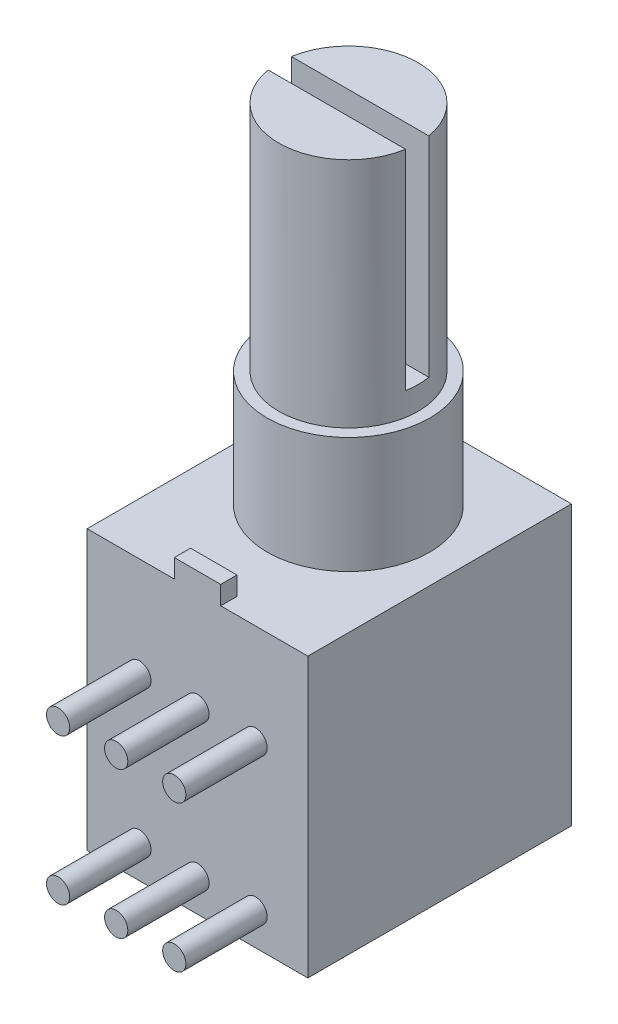
ISO-10303-21;
HEADER;
FILE_DESCRIPTION(('STEP AP214'),'2;1');
FILE_NAME('part.step','',(''),(''),'','','');
FILE_SCHEMA(('AUTOMOTIVE_DESIGN { 1 0 10303 214 1 1 1 1 }'));
ENDSEC;
DATA;
#1=APPLICATION_CONTEXT('core data for automotive mechanical design processes');
#2=APPLICATION_PROTOCOL_DEFINITION('international standard','automotive_design',2000,#1);
#3=PRODUCT_CONTEXT('',#1,'mechanical');
#4=PRODUCT('Part','Part','',(#3));
#5=PRODUCT_RELATED_PRODUCT_CATEGORY('part','',(#4));
#6=PRODUCT_DEFINITION_FORMATION('','',#4);
#7=PRODUCT_DEFINITION_CONTEXT('part definition',#1,'design');
#8=PRODUCT_DEFINITION('design','',#6,#7);
#9=PRODUCT_DEFINITION_SHAPE('','',#8);
#10=(LENGTH_UNIT() NAMED_UNIT(*) SI_UNIT(.MILLI.,.METRE.));
#11=(NAMED_UNIT(*) PLANE_ANGLE_UNIT() SI_UNIT($,.RADIAN.));
#12=(NAMED_UNIT(*) SI_UNIT($,.STERADIAN.) SOLID_ANGLE_UNIT());
#13=UNCERTAINTY_MEASURE_WITH_UNIT(LENGTH_MEASURE(1.E-05),#10,'distance_accuracy_value','');
#14=(GEOMETRIC_REPRESENTATION_CONTEXT(3) GLOBAL_UNCERTAINTY_ASSIGNED_CONTEXT((#13)) GLOBAL_UNIT_ASSIGNED_CONTEXT((#10,
#11,#12)) REPRESENTATION_CONTEXT('',''));
#15=CARTESIAN_POINT('',(0.,0.,0.));
#16=DIRECTION('',(0.,0.,1.));
#17=DIRECTION('',(1.,0.,0.));
#18=AXIS2_PLACEMENT_3D('',#15,#16,#17);
#19=CARTESIAN_POINT('',(0.,0.,0.));
#20=DIRECTION('',(0.,1.,0.));
#21=DIRECTION('',(0.,0.,1.));
#22=AXIS2_PLACEMENT_3D('',#19,#20,#21);
#23=PLANE('',#22);
#24=CARTESIAN_POINT('',(0.,0.,0.));
#25=DIRECTION('',(0.,1.,0.));
#26=DIRECTION('',(0.,0.,1.));
#27=AXIS2_PLACEMENT_3D('',#24,#25,#26);
#28=CIRCLE('',#27,3.5);
#29=CARTESIAN_POINT('',(0.,0.,3.5));
#30=VERTEX_POINT('',#29);
#31=EDGE_CURVE('E177',#30,#30,#28,.T.);
#32=ORIENTED_EDGE('',*,*,#31,.F.);
#33=EDGE_LOOP('',(#32));
#34=FACE_BOUND('',#33,.T.);
#35=DIRECTION('',(1.,0.,0.));
#36=VECTOR('',#35,1.);
#37=CARTESIAN_POINT('',(-4.75,0.,6.5));
#38=LINE('',#37,#36);
#39=CARTESIAN_POINT('',(-4.75,0.,6.5));
#40=VERTEX_POINT('',#39);
#41=CARTESIAN_POINT('',(-1.,0.,6.5));
#42=VERTEX_POINT('',#41);
#43=EDGE_CURVE('E202',#40,#42,#38,.T.);
#44=ORIENTED_EDGE('',*,*,#43,.T.);
#45=DIRECTION('',(0.,0.,1.));
#46=VECTOR('',#45,1.);
#47=CARTESIAN_POINT('',(-1.,0.,6.5));
#48=LINE('',#47,#46);
#49=CARTESIAN_POINT('',(-1.,0.,5.8));
#50=VERTEX_POINT('',#49);
#51=EDGE_CURVE('E147',#50,#42,#48,.T.);
#52=ORIENTED_EDGE('',*,*,#51,.F.);
#53=DIRECTION('',(-1.,0.,0.));
#54=VECTOR('',#53,1.);
#55=CARTESIAN_POINT('',(-1.,0.,5.8));
#56=LINE('',#55,#54);
#57=CARTESIAN_POINT('',(1.,0.,5.8));
#58=VERTEX_POINT('',#57);
#59=EDGE_CURVE('E143',#58,#50,#56,.T.);
#60=ORIENTED_EDGE('',*,*,#59,.F.);
#61=DIRECTION('',(0.,0.,-1.));
#62=VECTOR('',#61,1.);
#63=CARTESIAN_POINT('',(1.,0.,6.5));
#64=LINE('',#63,#62);
#65=CARTESIAN_POINT('',(1.,0.,6.5));
#66=VERTEX_POINT('',#65);
#67=EDGE_CURVE('E362',#66,#58,#64,.T.);
#68=ORIENTED_EDGE('',*,*,#67,.F.);
#69=CARTESIAN_POINT('',(4.75,0.,6.5));
#70=VERTEX_POINT('',#69);
#71=EDGE_CURVE('E201',#66,#70,#38,.T.);
#72=ORIENTED_EDGE('',*,*,#71,.T.);
#73=DIRECTION('',(0.,0.,-1.));
#74=VECTOR('',#73,1.);
#75=CARTESIAN_POINT('',(4.75,0.,-4.85));
#76=LINE('',#75,#74);
#77=CARTESIAN_POINT('',(4.75,0.,-4.85));
#78=VERTEX_POINT('',#77);
#79=EDGE_CURVE('E204',#70,#78,#76,.T.);
#80=ORIENTED_EDGE('',*,*,#79,.T.);
#81=DIRECTION('',(-1.,0.,0.));
#82=VECTOR('',#81,1.);
#83=CARTESIAN_POINT('',(-4.75,0.,-4.85));
#84=LINE('',#83,#82);
#85=CARTESIAN_POINT('',(-4.75,0.,-4.85));
#86=VERTEX_POINT('',#85);
#87=EDGE_CURVE('E189',#78,#86,#84,.T.);
#88=ORIENTED_EDGE('',*,*,#87,.T.);
#89=DIRECTION('',(0.,0.,1.));
#90=VECTOR('',#89,1.);
#91=CARTESIAN_POINT('',(-4.75,0.,-4.85));
#92=LINE('',#91,#90);
#93=EDGE_CURVE('E181',#86,#40,#92,.T.);
#94=ORIENTED_EDGE('',*,*,#93,.T.);
#95=EDGE_LOOP('',(#44,#52,#60,#68,#72,#80,#88,#94));
#96=FACE_BOUND('',#95,.T.);
#97=ADVANCED_FACE('F33',(#34,#96),#23,.T.);
#98=CARTESIAN_POINT('',(0.,15.,0.));
#99=DIRECTION('',(0.,1.,0.));
#100=DIRECTION('',(0.,0.,1.));
#101=AXIS2_PLACEMENT_3D('',#98,#99,#100);
#102=PLANE('',#101);
#103=DIRECTION('',(1.,0.,0.));
#104=VECTOR('',#103,1.);
#105=CARTESIAN_POINT('',(0.,15.,0.5));
#106=LINE('',#105,#104);
#107=CARTESIAN_POINT('',(-2.95803989154981,15.,0.5));
#108=VERTEX_POINT('',#107);
#109=CARTESIAN_POINT('',(2.95803989154981,15.,0.5));
#110=VERTEX_POINT('',#109);
#111=EDGE_CURVE('E216',#108,#110,#106,.T.);
#112=ORIENTED_EDGE('',*,*,#111,.F.);
#113=CARTESIAN_POINT('',(0.,15.,0.));
#114=DIRECTION('',(0.,1.,0.));
#115=DIRECTION('',(0.,0.,1.));
#116=AXIS2_PLACEMENT_3D('',#113,#114,#115);
#117=CIRCLE('',#116,3.);
#118=EDGE_CURVE('E169',#108,#110,#117,.T.);
#119=ORIENTED_EDGE('',*,*,#118,.T.);
#120=EDGE_LOOP('',(#112,#119));
#121=FACE_BOUND('',#120,.T.);
#122=ADVANCED_FACE('F231',(#121),#102,.T.);
#123=CARTESIAN_POINT('',(-4.75,-12.,-4.85));
#124=DIRECTION('',(-1.,0.,0.));
#125=DIRECTION('',(0.,0.,1.));
#126=AXIS2_PLACEMENT_3D('',#123,#124,#125);
#127=PLANE('',#126);
#128=ORIENTED_EDGE('',*,*,#93,.F.);
#129=DIRECTION('',(0.,1.,0.));
#130=VECTOR('',#129,1.);
#131=CARTESIAN_POINT('',(-4.75,-12.,-4.85));
#132=LINE('',#131,#130);
#133=CARTESIAN_POINT('',(-4.75,-12.,-4.85));
#134=VERTEX_POINT('',#133);
#135=EDGE_CURVE('E184',#134,#86,#132,.T.);
#136=ORIENTED_EDGE('',*,*,#135,.F.);
#137=DIRECTION('',(0.,0.,1.));
#138=VECTOR('',#137,1.);
#139=CARTESIAN_POINT('',(-4.75,-12.,-4.85));
#140=LINE('',#139,#138);
#141=CARTESIAN_POINT('',(-4.75,-12.,6.5));
#142=VERTEX_POINT('',#141);
#143=EDGE_CURVE('E185',#134,#142,#140,.T.);
#144=ORIENTED_EDGE('',*,*,#143,.T.);
#145=DIRECTION('',(0.,1.,0.));
#146=VECTOR('',#145,1.);
#147=CARTESIAN_POINT('',(-4.75,-12.,6.5));
#148=LINE('',#147,#146);
#149=EDGE_CURVE('E198',#142,#40,#148,.T.);
#150=ORIENTED_EDGE('',*,*,#149,.T.);
#151=EDGE_LOOP('',(#128,#136,#144,#150));
#152=FACE_BOUND('',#151,.T.);
#153=ADVANCED_FACE('F35',(#152),#127,.T.);
#154=CARTESIAN_POINT('',(-4.75,-12.,-4.85));
#155=DIRECTION('',(0.,0.,-1.));
#156=DIRECTION('',(-1.,0.,0.));
#157=AXIS2_PLACEMENT_3D('',#154,#155,#156);
#158=PLANE('',#157);
#159=ORIENTED_EDGE('',*,*,#87,.F.);
#160=DIRECTION('',(0.,1.,0.));
#161=VECTOR('',#160,1.);
#162=CARTESIAN_POINT('',(4.75,-12.,-4.85));
#163=LINE('',#162,#161);
#164=CARTESIAN_POINT('',(4.75,-12.,-4.85));
#165=VERTEX_POINT('',#164);
#166=EDGE_CURVE('E210',#165,#78,#163,.T.);
#167=ORIENTED_EDGE('',*,*,#166,.F.);
#168=DIRECTION('',(-1.,0.,0.));
#169=VECTOR('',#168,1.);
#170=CARTESIAN_POINT('',(-4.75,-12.,-4.85));
#171=LINE('',#170,#169);
#172=EDGE_CURVE('E195',#165,#134,#171,.T.);
#173=ORIENTED_EDGE('',*,*,#172,.T.);
#174=ORIENTED_EDGE('',*,*,#135,.T.);
#175=EDGE_LOOP('',(#159,#167,#173,#174));
#176=FACE_BOUND('',#175,.T.);
#177=ADVANCED_FACE('F239',(#176),#158,.T.);
#178=CARTESIAN_POINT('',(4.75,-12.,-4.85));
#179=DIRECTION('',(1.,0.,0.));
#180=DIRECTION('',(0.,0.,-1.));
#181=AXIS2_PLACEMENT_3D('',#178,#179,#180);
#182=PLANE('',#181);
#183=ORIENTED_EDGE('',*,*,#79,.F.);
#184=DIRECTION('',(0.,1.,0.));
#185=VECTOR('',#184,1.);
#186=CARTESIAN_POINT('',(4.75,-12.,6.5));
#187=LINE('',#186,#185);
#188=CARTESIAN_POINT('',(4.75,-12.,6.5));
#189=VERTEX_POINT('',#188);
#190=EDGE_CURVE('E212',#189,#70,#187,.T.);
#191=ORIENTED_EDGE('',*,*,#190,.F.);
#192=DIRECTION('',(0.,0.,-1.));
#193=VECTOR('',#192,1.);
#194=CARTESIAN_POINT('',(4.75,-12.,-4.85));
#195=LINE('',#194,#193);
#196=EDGE_CURVE('E192',#189,#165,#195,.T.);
#197=ORIENTED_EDGE('',*,*,#196,.T.);
#198=ORIENTED_EDGE('',*,*,#166,.T.);
#199=EDGE_LOOP('',(#183,#191,#197,#198));
#200=FACE_BOUND('',#199,.T.);
#201=ADVANCED_FACE('F379',(#200),#182,.T.);
#202=CARTESIAN_POINT('',(-4.75,-12.,6.5));
#203=DIRECTION('',(0.,0.,1.));
#204=DIRECTION('',(1.,0.,0.));
#205=AXIS2_PLACEMENT_3D('',#202,#203,#204);
#206=PLANE('',#205);
#207=CARTESIAN_POINT('',(-2.5,-10.6,6.5));
#208=DIRECTION('',(0.,0.,1.));
#209=DIRECTION('',(1.,0.,0.));
#210=AXIS2_PLACEMENT_3D('',#207,#208,#209);
#211=CIRCLE('',#210,0.5);
#212=CARTESIAN_POINT('',(-2.,-10.6,6.5));
#213=VERTEX_POINT('',#212);
#214=EDGE_CURVE('E324',#213,#213,#211,.T.);
#215=ORIENTED_EDGE('',*,*,#214,.F.);
#216=EDGE_LOOP('',(#215));
#217=FACE_BOUND('',#216,.T.);
#218=CARTESIAN_POINT('',(2.5,-10.6,6.5));
#219=DIRECTION('',(0.,0.,1.));
#220=DIRECTION('',(1.,0.,0.));
#221=AXIS2_PLACEMENT_3D('',#218,#219,#220);
#222=CIRCLE('',#221,0.499999999999999);
#223=CARTESIAN_POINT('',(3.,-10.6,6.5));
#224=VERTEX_POINT('',#223);
#225=EDGE_CURVE('E323',#224,#224,#222,.T.);
#226=ORIENTED_EDGE('',*,*,#225,.F.);
#227=EDGE_LOOP('',(#226));
#228=FACE_BOUND('',#227,.T.);
#229=CARTESIAN_POINT('',(0.,-10.6,6.5));
#230=DIRECTION('',(0.,0.,1.));
#231=DIRECTION('',(1.,0.,0.));
#232=AXIS2_PLACEMENT_3D('',#229,#230,#231);
#233=CIRCLE('',#232,0.499999999999999);
#234=CARTESIAN_POINT('',(0.5,-10.6,6.5));
#235=VERTEX_POINT('',#234);
#236=EDGE_CURVE('E333',#235,#235,#233,.T.);
#237=ORIENTED_EDGE('',*,*,#236,.F.);
#238=EDGE_LOOP('',(#237));
#239=FACE_BOUND('',#238,.T.);
#240=CARTESIAN_POINT('',(2.5,-4.3,6.5));
#241=DIRECTION('',(0.,0.,1.));
#242=DIRECTION('',(1.,0.,0.));
#243=AXIS2_PLACEMENT_3D('',#240,#241,#242);
#244=CIRCLE('',#243,0.499999999999999);
#245=CARTESIAN_POINT('',(3.,-4.3,6.5));
#246=VERTEX_POINT('',#245);
#247=EDGE_CURVE('E338',#246,#246,#244,.T.);
#248=ORIENTED_EDGE('',*,*,#247,.F.);
#249=EDGE_LOOP('',(#248));
#250=FACE_BOUND('',#249,.T.);
#251=CARTESIAN_POINT('',(0.,-4.3,6.5));
#252=DIRECTION('',(0.,0.,1.));
#253=DIRECTION('',(1.,0.,0.));
#254=AXIS2_PLACEMENT_3D('',#251,#252,#253);
#255=CIRCLE('',#254,0.499999999999999);
#256=CARTESIAN_POINT('',(0.499999999999999,-4.3,6.5));
#257=VERTEX_POINT('',#256);
#258=EDGE_CURVE('E344',#257,#257,#255,.T.);
#259=ORIENTED_EDGE('',*,*,#258,.F.);
#260=EDGE_LOOP('',(#259));
#261=FACE_BOUND('',#260,.T.);
#262=CARTESIAN_POINT('',(-2.5,-4.3,6.5));
#263=DIRECTION('',(0.,0.,1.));
#264=DIRECTION('',(1.,0.,0.));
#265=AXIS2_PLACEMENT_3D('',#262,#263,#264);
#266=CIRCLE('',#265,0.5);
#267=CARTESIAN_POINT('',(-2.,-4.3,6.5));
#268=VERTEX_POINT('',#267);
#269=EDGE_CURVE('E350',#268,#268,#266,.T.);
#270=ORIENTED_EDGE('',*,*,#269,.F.);
#271=EDGE_LOOP('',(#270));
#272=FACE_BOUND('',#271,.T.);
#273=ORIENTED_EDGE('',*,*,#43,.F.);
#274=ORIENTED_EDGE('',*,*,#149,.F.);
#275=DIRECTION('',(1.,0.,0.));
#276=VECTOR('',#275,1.);
#277=CARTESIAN_POINT('',(-4.75,-12.,6.5));
#278=LINE('',#277,#276);
#279=EDGE_CURVE('E188',#142,#189,#278,.T.);
#280=ORIENTED_EDGE('',*,*,#279,.T.);
#281=ORIENTED_EDGE('',*,*,#190,.T.);
#282=ORIENTED_EDGE('',*,*,#71,.F.);
#283=DIRECTION('',(0.,-1.,0.));
#284=VECTOR('',#283,1.);
#285=CARTESIAN_POINT('',(1.,0.8,6.5));
#286=LINE('',#285,#284);
#287=CARTESIAN_POINT('',(1.,0.8,6.5));
#288=VERTEX_POINT('',#287);
#289=EDGE_CURVE('E131',#288,#66,#286,.T.);
#290=ORIENTED_EDGE('',*,*,#289,.F.);
#291=DIRECTION('',(1.,0.,0.));
#292=VECTOR('',#291,1.);
#293=CARTESIAN_POINT('',(-1.,0.8,6.5));
#294=LINE('',#293,#292);
#295=CARTESIAN_POINT('',(-1.,0.8,6.5));
#296=VERTEX_POINT('',#295);
#297=EDGE_CURVE('E123',#296,#288,#294,.T.);
#298=ORIENTED_EDGE('',*,*,#297,.F.);
#299=DIRECTION('',(0.,-1.,0.));
#300=VECTOR('',#299,1.);
#301=CARTESIAN_POINT('',(-1.,0.8,6.5));
#302=LINE('',#301,#300);
#303=EDGE_CURVE('E128',#296,#42,#302,.T.);
#304=ORIENTED_EDGE('',*,*,#303,.T.);
#305=EDGE_LOOP('',(#273,#274,#280,#281,#282,#290,#298,#304));
#306=FACE_BOUND('',#305,.T.);
#307=ADVANCED_FACE('F126',(#217,#228,#239,#250,#261,#272,#306),#206,.T.);
#308=CARTESIAN_POINT('',(0.,-12.,0.));
#309=DIRECTION('',(0.,1.,0.));
#310=DIRECTION('',(0.,0.,1.));
#311=AXIS2_PLACEMENT_3D('',#308,#309,#310);
#312=PLANE('',#311);
#313=ORIENTED_EDGE('',*,*,#143,.F.);
#314=ORIENTED_EDGE('',*,*,#172,.F.);
#315=ORIENTED_EDGE('',*,*,#196,.F.);
#316=ORIENTED_EDGE('',*,*,#279,.F.);
#317=EDGE_LOOP('',(#313,#314,#315,#316));
#318=FACE_BOUND('',#317,.T.);
#319=ADVANCED_FACE('F373',(#318),#312,.F.);
#320=CARTESIAN_POINT('',(0.,5.,0.));
#321=DIRECTION('',(0.,-1.,0.));
#322=DIRECTION('',(0.,0.,-1.));
#323=AXIS2_PLACEMENT_3D('',#320,#321,#322);
#324=CYLINDRICAL_SURFACE('',#323,3.5);
#325=CARTESIAN_POINT('',(0.,5.,0.));
#326=DIRECTION('',(0.,1.,0.));
#327=DIRECTION('',(0.,0.,1.));
#328=AXIS2_PLACEMENT_3D('',#325,#326,#327);
#329=CIRCLE('',#328,3.5);
#330=CARTESIAN_POINT('',(0.,5.,3.5));
#331=VERTEX_POINT('',#330);
#332=EDGE_CURVE('E178',#331,#331,#329,.T.);
#333=ORIENTED_EDGE('',*,*,#332,.F.);
#334=EDGE_LOOP('',(#333));
#335=FACE_BOUND('',#334,.T.);
#336=ORIENTED_EDGE('',*,*,#31,.T.);
#337=EDGE_LOOP('',(#336));
#338=FACE_BOUND('',#337,.T.);
#339=ADVANCED_FACE('F391',(#335,#338),#324,.T.);
#340=CARTESIAN_POINT('',(0.,5.,0.));
#341=DIRECTION('',(0.,1.,0.));
#342=DIRECTION('',(0.,0.,1.));
#343=AXIS2_PLACEMENT_3D('',#340,#341,#342);
#344=PLANE('',#343);
#345=CARTESIAN_POINT('',(0.,5.,0.));
#346=DIRECTION('',(0.,1.,0.));
#347=DIRECTION('',(0.,0.,1.));
#348=AXIS2_PLACEMENT_3D('',#345,#346,#347);
#349=CIRCLE('',#348,3.);
#350=CARTESIAN_POINT('',(0.,5.,3.));
#351=VERTEX_POINT('',#350);
#352=EDGE_CURVE('E173',#351,#351,#349,.T.);
#353=ORIENTED_EDGE('',*,*,#352,.F.);
#354=EDGE_LOOP('',(#353));
#355=FACE_BOUND('',#354,.T.);
#356=ORIENTED_EDGE('',*,*,#332,.T.);
#357=EDGE_LOOP('',(#356));
#358=FACE_BOUND('',#357,.T.);
#359=ADVANCED_FACE('F252',(#355,#358),#344,.T.);
#360=CARTESIAN_POINT('',(0.,15.,0.));
#361=DIRECTION('',(0.,-1.,0.));
#362=DIRECTION('',(0.,0.,-1.));
#363=AXIS2_PLACEMENT_3D('',#360,#361,#362);
#364=CYLINDRICAL_SURFACE('',#363,3.);
#365=CARTESIAN_POINT('',(0.,6.,0.));
#366=DIRECTION('',(0.,-1.,0.));
#367=DIRECTION('',(0.,0.,-1.));
#368=AXIS2_PLACEMENT_3D('',#365,#366,#367);
#369=CIRCLE('',#368,3.);
#370=CARTESIAN_POINT('',(2.95803989154981,6.,-0.5));
#371=VERTEX_POINT('',#370);
#372=CARTESIAN_POINT('',(2.95803989154981,6.,0.5));
#373=VERTEX_POINT('',#372);
#374=EDGE_CURVE('E11',#371,#373,#369,.T.);
#375=ORIENTED_EDGE('',*,*,#374,.T.);
#376=DIRECTION('',(0.,-1.,0.));
#377=VECTOR('',#376,1.);
#378=CARTESIAN_POINT('',(2.95803989154981,15.,0.5));
#379=LINE('',#378,#377);
#380=EDGE_CURVE('E163',#373,#110,#379,.F.);
#381=ORIENTED_EDGE('',*,*,#380,.T.);
#382=ORIENTED_EDGE('',*,*,#118,.F.);
#383=DIRECTION('',(0.,-1.,0.));
#384=VECTOR('',#383,1.);
#385=CARTESIAN_POINT('',(-2.95803989154981,15.,0.5));
#386=LINE('',#385,#384);
#387=CARTESIAN_POINT('',(-2.95803989154981,6.,0.5));
#388=VERTEX_POINT('',#387);
#389=EDGE_CURVE('E166',#108,#388,#386,.T.);
#390=ORIENTED_EDGE('',*,*,#389,.T.);
#391=CARTESIAN_POINT('',(-2.95803989154981,6.,-0.5));
#392=VERTEX_POINT('',#391);
#393=EDGE_CURVE('E37',#388,#392,#369,.T.);
#394=ORIENTED_EDGE('',*,*,#393,.T.);
#395=DIRECTION('',(0.,-1.,0.));
#396=VECTOR('',#395,1.);
#397=CARTESIAN_POINT('',(-2.95803989154981,15.,-0.5));
#398=LINE('',#397,#396);
#399=CARTESIAN_POINT('',(-2.95803989154981,15.,-0.5));
#400=VERTEX_POINT('',#399);
#401=EDGE_CURVE('E159',#392,#400,#398,.F.);
#402=ORIENTED_EDGE('',*,*,#401,.T.);
#403=CARTESIAN_POINT('',(2.95803989154981,15.,-0.5));
#404=VERTEX_POINT('',#403);
#405=EDGE_CURVE('E172',#404,#400,#117,.T.);
#406=ORIENTED_EDGE('',*,*,#405,.F.);
#407=DIRECTION('',(0.,-1.,0.));
#408=VECTOR('',#407,1.);
#409=CARTESIAN_POINT('',(2.95803989154981,15.,-0.5));
#410=LINE('',#409,#408);
#411=EDGE_CURVE('E56',#404,#371,#410,.T.);
#412=ORIENTED_EDGE('',*,*,#411,.T.);
#413=EDGE_LOOP('',(#375,#381,#382,#390,#394,#402,#406,#412));
#414=FACE_BOUND('',#413,.T.);
#415=ORIENTED_EDGE('',*,*,#352,.T.);
#416=EDGE_LOOP('',(#415));
#417=FACE_BOUND('',#416,.T.);
#418=ADVANCED_FACE('F221',(#414,#417),#364,.T.);
#419=DIRECTION('',(-1.,0.,0.));
#420=VECTOR('',#419,1.);
#421=CARTESIAN_POINT('',(0.,15.,-0.5));
#422=LINE('',#421,#420);
#423=EDGE_CURVE('E176',#404,#400,#422,.T.);
#424=ORIENTED_EDGE('',*,*,#423,.F.);
#425=ORIENTED_EDGE('',*,*,#405,.T.);
#426=EDGE_LOOP('',(#424,#425));
#427=FACE_BOUND('',#426,.T.);
#428=ADVANCED_FACE('F234',(#427),#102,.T.);
#429=CARTESIAN_POINT('',(0.,6.,0.));
#430=DIRECTION('',(0.,-1.,0.));
#431=DIRECTION('',(0.,0.,-1.));
#432=AXIS2_PLACEMENT_3D('',#429,#430,#431);
#433=PLANE('',#432);
#434=DIRECTION('',(-1.,0.,0.));
#435=VECTOR('',#434,1.);
#436=CARTESIAN_POINT('',(-5.,6.,-0.5));
#437=LINE('',#436,#435);
#438=EDGE_CURVE('E149',#371,#392,#437,.T.);
#439=ORIENTED_EDGE('',*,*,#438,.T.);
#440=ORIENTED_EDGE('',*,*,#393,.F.);
#441=DIRECTION('',(1.,0.,0.));
#442=VECTOR('',#441,1.);
#443=CARTESIAN_POINT('',(-5.,6.,0.5));
#444=LINE('',#443,#442);
#445=EDGE_CURVE('E152',#388,#373,#444,.T.);
#446=ORIENTED_EDGE('',*,*,#445,.T.);
#447=ORIENTED_EDGE('',*,*,#374,.F.);
#448=EDGE_LOOP('',(#439,#440,#446,#447));
#449=FACE_BOUND('',#448,.T.);
#450=ADVANCED_FACE('F228',(#449),#433,.F.);
#451=CARTESIAN_POINT('',(-5.,6.,0.5));
#452=DIRECTION('',(0.,0.,1.));
#453=DIRECTION('',(1.,0.,0.));
#454=AXIS2_PLACEMENT_3D('',#451,#452,#453);
#455=PLANE('',#454);
#456=ORIENTED_EDGE('',*,*,#111,.T.);
#457=ORIENTED_EDGE('',*,*,#380,.F.);
#458=ORIENTED_EDGE('',*,*,#445,.F.);
#459=ORIENTED_EDGE('',*,*,#389,.F.);
#460=EDGE_LOOP('',(#456,#457,#458,#459));
#461=FACE_BOUND('',#460,.T.);
#462=ADVANCED_FACE('F229',(#461),#455,.F.);
#463=CARTESIAN_POINT('',(-5.,6.,-0.5));
#464=DIRECTION('',(0.,0.,-1.));
#465=DIRECTION('',(-1.,0.,0.));
#466=AXIS2_PLACEMENT_3D('',#463,#464,#465);
#467=PLANE('',#466);
#468=ORIENTED_EDGE('',*,*,#423,.T.);
#469=ORIENTED_EDGE('',*,*,#401,.F.);
#470=ORIENTED_EDGE('',*,*,#438,.F.);
#471=ORIENTED_EDGE('',*,*,#411,.F.);
#472=EDGE_LOOP('',(#468,#469,#470,#471));
#473=FACE_BOUND('',#472,.T.);
#474=ADVANCED_FACE('F253',(#473),#467,.F.);
#475=CARTESIAN_POINT('',(-1.,0.8,6.5));
#476=DIRECTION('',(1.,0.,0.));
#477=DIRECTION('',(0.,0.,-1.));
#478=AXIS2_PLACEMENT_3D('',#475,#476,#477);
#479=PLANE('',#478);
#480=ORIENTED_EDGE('',*,*,#51,.T.);
#481=ORIENTED_EDGE('',*,*,#303,.F.);
#482=DIRECTION('',(0.,0.,1.));
#483=VECTOR('',#482,1.);
#484=CARTESIAN_POINT('',(-1.,0.8,6.5));
#485=LINE('',#484,#483);
#486=CARTESIAN_POINT('',(-1.,0.8,5.8));
#487=VERTEX_POINT('',#486);
#488=EDGE_CURVE('E135',#487,#296,#485,.T.);
#489=ORIENTED_EDGE('',*,*,#488,.F.);
#490=DIRECTION('',(0.,-1.,0.));
#491=VECTOR('',#490,1.);
#492=CARTESIAN_POINT('',(-1.,0.8,5.8));
#493=LINE('',#492,#491);
#494=EDGE_CURVE('E360',#487,#50,#493,.T.);
#495=ORIENTED_EDGE('',*,*,#494,.T.);
#496=EDGE_LOOP('',(#480,#481,#489,#495));
#497=FACE_BOUND('',#496,.T.);
#498=ADVANCED_FACE('F145',(#497),#479,.F.);
#499=CARTESIAN_POINT('',(1.,0.8,6.5));
#500=DIRECTION('',(-1.,0.,0.));
#501=DIRECTION('',(0.,0.,1.));
#502=AXIS2_PLACEMENT_3D('',#499,#500,#501);
#503=PLANE('',#502);
#504=ORIENTED_EDGE('',*,*,#67,.T.);
#505=DIRECTION('',(0.,-1.,0.));
#506=VECTOR('',#505,1.);
#507=CARTESIAN_POINT('',(1.,0.8,5.8));
#508=LINE('',#507,#506);
#509=CARTESIAN_POINT('',(1.,0.8,5.8));
#510=VERTEX_POINT('',#509);
#511=EDGE_CURVE('E48',#510,#58,#508,.T.);
#512=ORIENTED_EDGE('',*,*,#511,.F.);
#513=DIRECTION('',(0.,0.,-1.));
#514=VECTOR('',#513,1.);
#515=CARTESIAN_POINT('',(1.,0.8,6.5));
#516=LINE('',#515,#514);
#517=EDGE_CURVE('E134',#288,#510,#516,.T.);
#518=ORIENTED_EDGE('',*,*,#517,.F.);
#519=ORIENTED_EDGE('',*,*,#289,.T.);
#520=EDGE_LOOP('',(#504,#512,#518,#519));
#521=FACE_BOUND('',#520,.T.);
#522=ADVANCED_FACE('F259',(#521),#503,.F.);
#523=CARTESIAN_POINT('',(-1.,0.8,5.8));
#524=DIRECTION('',(0.,0.,1.));
#525=DIRECTION('',(1.,0.,0.));
#526=AXIS2_PLACEMENT_3D('',#523,#524,#525);
#527=PLANE('',#526);
#528=ORIENTED_EDGE('',*,*,#59,.T.);
#529=ORIENTED_EDGE('',*,*,#494,.F.);
#530=DIRECTION('',(-1.,0.,0.));
#531=VECTOR('',#530,1.);
#532=CARTESIAN_POINT('',(-1.,0.8,5.8));
#533=LINE('',#532,#531);
#534=EDGE_CURVE('E139',#510,#487,#533,.T.);
#535=ORIENTED_EDGE('',*,*,#534,.F.);
#536=ORIENTED_EDGE('',*,*,#511,.T.);
#537=EDGE_LOOP('',(#528,#529,#535,#536));
#538=FACE_BOUND('',#537,.T.);
#539=ADVANCED_FACE('F265',(#538),#527,.F.);
#540=CARTESIAN_POINT('',(0.,0.8,0.));
#541=DIRECTION('',(0.,-1.,0.));
#542=DIRECTION('',(0.,0.,-1.));
#543=AXIS2_PLACEMENT_3D('',#540,#541,#542);
#544=PLANE('',#543);
#545=ORIENTED_EDGE('',*,*,#488,.T.);
#546=ORIENTED_EDGE('',*,*,#297,.T.);
#547=ORIENTED_EDGE('',*,*,#517,.T.);
#548=ORIENTED_EDGE('',*,*,#534,.T.);
#549=EDGE_LOOP('',(#545,#546,#547,#548));
#550=FACE_BOUND('',#549,.T.);
#551=ADVANCED_FACE('F138',(#550),#544,.F.);
#552=CARTESIAN_POINT('',(-2.5,-4.3,10.));
#553=DIRECTION('',(0.,0.,-1.));
#554=DIRECTION('',(-1.,0.,0.));
#555=AXIS2_PLACEMENT_3D('',#552,#553,#554);
#556=CYLINDRICAL_SURFACE('',#555,0.5);
#557=CARTESIAN_POINT('',(-2.5,-4.3,10.));
#558=DIRECTION('',(0.,0.,1.));
#559=DIRECTION('',(1.,0.,0.));
#560=AXIS2_PLACEMENT_3D('',#557,#558,#559);
#561=CIRCLE('',#560,0.5);
#562=CARTESIAN_POINT('',(-2.,-4.3,10.));
#563=VERTEX_POINT('',#562);
#564=EDGE_CURVE('E353',#563,#563,#561,.T.);
#565=ORIENTED_EDGE('',*,*,#564,.F.);
#566=EDGE_LOOP('',(#565));
#567=FACE_BOUND('',#566,.T.);
#568=ORIENTED_EDGE('',*,*,#269,.T.);
#569=EDGE_LOOP('',(#568));
#570=FACE_BOUND('',#569,.T.);
#571=ADVANCED_FACE('F271',(#567,#570),#556,.T.);
#572=CARTESIAN_POINT('',(-2.5,-4.3,10.));
#573=DIRECTION('',(0.,0.,1.));
#574=DIRECTION('',(1.,0.,0.));
#575=AXIS2_PLACEMENT_3D('',#572,#573,#574);
#576=PLANE('',#575);
#577=ORIENTED_EDGE('',*,*,#564,.T.);
#578=EDGE_LOOP('',(#577));
#579=FACE_BOUND('',#578,.T.);
#580=ADVANCED_FACE('F274',(#579),#576,.T.);
#581=CARTESIAN_POINT('',(0.,-4.3,10.));
#582=DIRECTION('',(0.,0.,-1.));
#583=DIRECTION('',(-1.,0.,0.));
#584=AXIS2_PLACEMENT_3D('',#581,#582,#583);
#585=CYLINDRICAL_SURFACE('',#584,0.499999999999999);
#586=CARTESIAN_POINT('',(0.,-4.3,10.));
#587=DIRECTION('',(0.,0.,1.));
#588=DIRECTION('',(1.,0.,0.));
#589=AXIS2_PLACEMENT_3D('',#586,#587,#588);
#590=CIRCLE('',#589,0.499999999999999);
#591=CARTESIAN_POINT('',(0.499999999999999,-4.3,10.));
#592=VERTEX_POINT('',#591);
#593=EDGE_CURVE('E347',#592,#592,#590,.T.);
#594=ORIENTED_EDGE('',*,*,#593,.F.);
#595=EDGE_LOOP('',(#594));
#596=FACE_BOUND('',#595,.T.);
#597=ORIENTED_EDGE('',*,*,#258,.T.);
#598=EDGE_LOOP('',(#597));
#599=FACE_BOUND('',#598,.T.);
#600=ADVANCED_FACE('F278',(#596,#599),#585,.T.);
#601=CARTESIAN_POINT('',(0.,-4.3,10.));
#602=DIRECTION('',(0.,0.,1.));
#603=DIRECTION('',(1.,0.,0.));
#604=AXIS2_PLACEMENT_3D('',#601,#602,#603);
#605=PLANE('',#604);
#606=ORIENTED_EDGE('',*,*,#593,.T.);
#607=EDGE_LOOP('',(#606));
#608=FACE_BOUND('',#607,.T.);
#609=ADVANCED_FACE('F282',(#608),#605,.T.);
#610=CARTESIAN_POINT('',(2.5,-4.3,10.));
#611=DIRECTION('',(0.,0.,-1.));
#612=DIRECTION('',(-1.,0.,0.));
#613=AXIS2_PLACEMENT_3D('',#610,#611,#612);
#614=CYLINDRICAL_SURFACE('',#613,0.499999999999999);
#615=CARTESIAN_POINT('',(2.5,-4.3,10.));
#616=DIRECTION('',(0.,0.,1.));
#617=DIRECTION('',(1.,0.,0.));
#618=AXIS2_PLACEMENT_3D('',#615,#616,#617);
#619=CIRCLE('',#618,0.499999999999999);
#620=CARTESIAN_POINT('',(3.,-4.3,10.));
#621=VERTEX_POINT('',#620);
#622=EDGE_CURVE('E341',#621,#621,#619,.T.);
#623=ORIENTED_EDGE('',*,*,#622,.F.);
#624=EDGE_LOOP('',(#623));
#625=FACE_BOUND('',#624,.T.);
#626=ORIENTED_EDGE('',*,*,#247,.T.);
#627=EDGE_LOOP('',(#626));
#628=FACE_BOUND('',#627,.T.);
#629=ADVANCED_FACE('F286',(#625,#628),#614,.T.);
#630=CARTESIAN_POINT('',(2.5,-4.3,10.));
#631=DIRECTION('',(0.,0.,1.));
#632=DIRECTION('',(1.,0.,0.));
#633=AXIS2_PLACEMENT_3D('',#630,#631,#632);
#634=PLANE('',#633);
#635=ORIENTED_EDGE('',*,*,#622,.T.);
#636=EDGE_LOOP('',(#635));
#637=FACE_BOUND('',#636,.T.);
#638=ADVANCED_FACE('F290',(#637),#634,.T.);
#639=CARTESIAN_POINT('',(0.,-10.6,10.));
#640=DIRECTION('',(0.,0.,-1.));
#641=DIRECTION('',(-1.,0.,0.));
#642=AXIS2_PLACEMENT_3D('',#639,#640,#641);
#643=CYLINDRICAL_SURFACE('',#642,0.499999999999999);
#644=CARTESIAN_POINT('',(0.,-10.6,10.));
#645=DIRECTION('',(0.,0.,1.));
#646=DIRECTION('',(1.,0.,0.));
#647=AXIS2_PLACEMENT_3D('',#644,#645,#646);
#648=CIRCLE('',#647,0.499999999999999);
#649=CARTESIAN_POINT('',(0.5,-10.6,10.));
#650=VERTEX_POINT('',#649);
#651=EDGE_CURVE('E335',#650,#650,#648,.T.);
#652=ORIENTED_EDGE('',*,*,#651,.F.);
#653=EDGE_LOOP('',(#652));
#654=FACE_BOUND('',#653,.T.);
#655=ORIENTED_EDGE('',*,*,#236,.T.);
#656=EDGE_LOOP('',(#655));
#657=FACE_BOUND('',#656,.T.);
#658=ADVANCED_FACE('F294',(#654,#657),#643,.T.);
#659=CARTESIAN_POINT('',(0.,-10.6,10.));
#660=DIRECTION('',(0.,0.,1.));
#661=DIRECTION('',(1.,0.,0.));
#662=AXIS2_PLACEMENT_3D('',#659,#660,#661);
#663=PLANE('',#662);
#664=ORIENTED_EDGE('',*,*,#651,.T.);
#665=EDGE_LOOP('',(#664));
#666=FACE_BOUND('',#665,.T.);
#667=ADVANCED_FACE('F298',(#666),#663,.T.);
#668=CARTESIAN_POINT('',(2.5,-10.6,10.));
#669=DIRECTION('',(0.,0.,-1.));
#670=DIRECTION('',(-1.,0.,0.));
#671=AXIS2_PLACEMENT_3D('',#668,#669,#670);
#672=CYLINDRICAL_SURFACE('',#671,0.499999999999999);
#673=CARTESIAN_POINT('',(2.5,-10.6,10.));
#674=DIRECTION('',(0.,0.,1.));
#675=DIRECTION('',(1.,0.,0.));
#676=AXIS2_PLACEMENT_3D('',#673,#674,#675);
#677=CIRCLE('',#676,0.499999999999999);
#678=CARTESIAN_POINT('',(3.,-10.6,10.));
#679=VERTEX_POINT('',#678);
#680=EDGE_CURVE('E327',#679,#679,#677,.T.);
#681=ORIENTED_EDGE('',*,*,#680,.F.);
#682=EDGE_LOOP('',(#681));
#683=FACE_BOUND('',#682,.T.);
#684=ORIENTED_EDGE('',*,*,#225,.T.);
#685=EDGE_LOOP('',(#684));
#686=FACE_BOUND('',#685,.T.);
#687=ADVANCED_FACE('F302',(#683,#686),#672,.T.);
#688=CARTESIAN_POINT('',(2.5,-10.6,10.));
#689=DIRECTION('',(0.,0.,1.));
#690=DIRECTION('',(1.,0.,0.));
#691=AXIS2_PLACEMENT_3D('',#688,#689,#690);
#692=PLANE('',#691);
#693=ORIENTED_EDGE('',*,*,#680,.T.);
#694=EDGE_LOOP('',(#693));
#695=FACE_BOUND('',#694,.T.);
#696=ADVANCED_FACE('F306',(#695),#692,.T.);
#697=CARTESIAN_POINT('',(-2.5,-10.6,10.));
#698=DIRECTION('',(0.,0.,-1.));
#699=DIRECTION('',(-1.,0.,0.));
#700=AXIS2_PLACEMENT_3D('',#697,#698,#699);
#701=CYLINDRICAL_SURFACE('',#700,0.5);
#702=CARTESIAN_POINT('',(-2.5,-10.6,10.));
#703=DIRECTION('',(0.,0.,1.));
#704=DIRECTION('',(1.,0.,0.));
#705=AXIS2_PLACEMENT_3D('',#702,#703,#704);
#706=CIRCLE('',#705,0.5);
#707=CARTESIAN_POINT('',(-2.,-10.6,10.));
#708=VERTEX_POINT('',#707);
#709=EDGE_CURVE('E322',#708,#708,#706,.T.);
#710=ORIENTED_EDGE('',*,*,#709,.F.);
#711=EDGE_LOOP('',(#710));
#712=FACE_BOUND('',#711,.T.);
#713=ORIENTED_EDGE('',*,*,#214,.T.);
#714=EDGE_LOOP('',(#713));
#715=FACE_BOUND('',#714,.T.);
#716=ADVANCED_FACE('F310',(#712,#715),#701,.T.);
#717=CARTESIAN_POINT('',(-2.5,-10.6,10.));
#718=DIRECTION('',(0.,0.,1.));
#719=DIRECTION('',(1.,0.,0.));
#720=AXIS2_PLACEMENT_3D('',#717,#718,#719);
#721=PLANE('',#720);
#722=ORIENTED_EDGE('',*,*,#709,.T.);
#723=EDGE_LOOP('',(#722));
#724=FACE_BOUND('',#723,.T.);
#725=ADVANCED_FACE('F314',(#724),#721,.T.);
#726=CLOSED_SHELL('',(#97,#122,#153,#177,#201,#307,#319,#339,#359,#418,#428,#450,#462,#474,#498,
#522,#539,#551,#571,#580,#600,#609,#629,#638,#658,#667,#687,#696,#716,#725));
#727=MANIFOLD_SOLID_BREP('B2',#726);
#728=ADVANCED_BREP_SHAPE_REPRESENTATION('',(#18,#727),#14);
#729=SHAPE_DEFINITION_REPRESENTATION(#9,#728);
ENDSEC;
END-ISO-10303-21;
